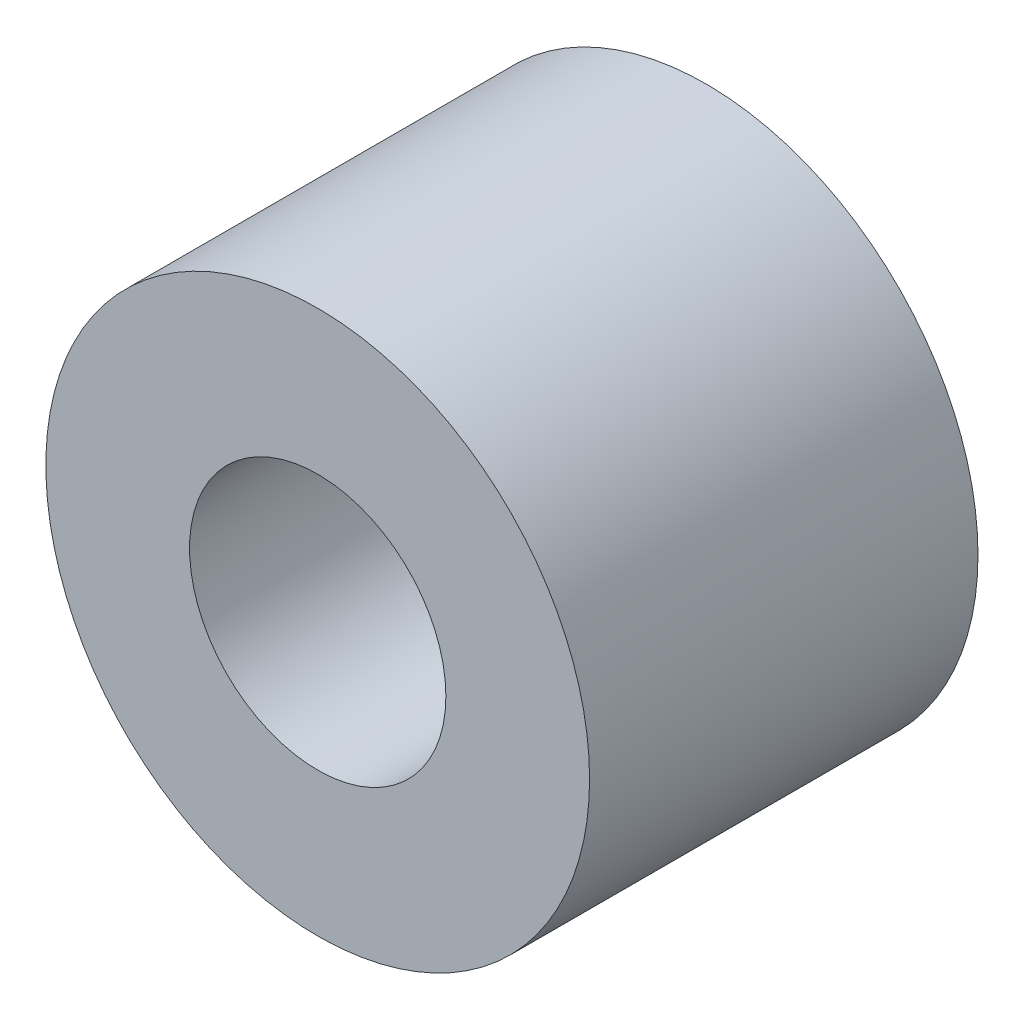
ISO-10303-21;
HEADER;
FILE_DESCRIPTION(('STEP AP214'),'2;1');
FILE_NAME('part.step','',(''),(''),'','','');
FILE_SCHEMA(('AUTOMOTIVE_DESIGN { 1 0 10303 214 1 1 1 1 }'));
ENDSEC;
DATA;
#1=APPLICATION_CONTEXT('core data for automotive mechanical design processes');
#2=APPLICATION_PROTOCOL_DEFINITION('international standard','automotive_design',2000,#1);
#3=PRODUCT_CONTEXT('',#1,'mechanical');
#4=PRODUCT('Part','Part','',(#3));
#5=PRODUCT_RELATED_PRODUCT_CATEGORY('part','',(#4));
#6=PRODUCT_DEFINITION_FORMATION('','',#4);
#7=PRODUCT_DEFINITION_CONTEXT('part definition',#1,'design');
#8=PRODUCT_DEFINITION('design','',#6,#7);
#9=PRODUCT_DEFINITION_SHAPE('','',#8);
#10=(LENGTH_UNIT() NAMED_UNIT(*) SI_UNIT(.MILLI.,.METRE.));
#11=(NAMED_UNIT(*) PLANE_ANGLE_UNIT() SI_UNIT($,.RADIAN.));
#12=(NAMED_UNIT(*) SI_UNIT($,.STERADIAN.) SOLID_ANGLE_UNIT());
#13=UNCERTAINTY_MEASURE_WITH_UNIT(LENGTH_MEASURE(1.E-05),#10,'distance_accuracy_value','');
#14=(GEOMETRIC_REPRESENTATION_CONTEXT(3) GLOBAL_UNCERTAINTY_ASSIGNED_CONTEXT((#13)) GLOBAL_UNIT_ASSIGNED_CONTEXT((#10,
#11,#12)) REPRESENTATION_CONTEXT('',''));
#15=CARTESIAN_POINT('',(0.,0.,0.));
#16=DIRECTION('',(0.,0.,1.));
#17=DIRECTION('',(1.,0.,0.));
#18=AXIS2_PLACEMENT_3D('',#15,#16,#17);
#19=CARTESIAN_POINT('',(0.,0.,5.));
#20=DIRECTION('',(0.,0.,1.));
#21=DIRECTION('',(1.,0.,0.));
#22=AXIS2_PLACEMENT_3D('',#19,#20,#21);
#23=PLANE('',#22);
#24=CARTESIAN_POINT('',(0.,0.,5.));
#25=DIRECTION('',(0.,0.,1.));
#26=DIRECTION('',(1.,0.,0.));
#27=AXIS2_PLACEMENT_3D('',#24,#25,#26);
#28=CIRCLE('',#27,3.5);
#29=CARTESIAN_POINT('',(3.5,0.,5.));
#30=VERTEX_POINT('',#29);
#31=EDGE_CURVE('E10',#30,#30,#28,.T.);
#32=ORIENTED_EDGE('',*,*,#31,.T.);
#33=EDGE_LOOP('',(#32));
#34=FACE_BOUND('',#33,.T.);
#35=CARTESIAN_POINT('',(0.,0.,5.));
#36=DIRECTION('',(0.,0.,1.));
#37=DIRECTION('',(1.,0.,0.));
#38=AXIS2_PLACEMENT_3D('',#35,#36,#37);
#39=CIRCLE('',#38,1.65);
#40=CARTESIAN_POINT('',(1.65,0.,5.));
#41=VERTEX_POINT('',#40);
#42=EDGE_CURVE('E52',#41,#41,#39,.T.);
#43=ORIENTED_EDGE('',*,*,#42,.F.);
#44=EDGE_LOOP('',(#43));
#45=FACE_BOUND('',#44,.T.);
#46=ADVANCED_FACE('F41',(#34,#45),#23,.T.);
#47=CARTESIAN_POINT('',(0.,0.,0.));
#48=DIRECTION('',(0.,0.,1.));
#49=DIRECTION('',(1.,0.,0.));
#50=AXIS2_PLACEMENT_3D('',#47,#48,#49);
#51=PLANE('',#50);
#52=CARTESIAN_POINT('',(0.,0.,0.));
#53=DIRECTION('',(0.,0.,1.));
#54=DIRECTION('',(1.,0.,0.));
#55=AXIS2_PLACEMENT_3D('',#52,#53,#54);
#56=CIRCLE('',#55,3.5);
#57=CARTESIAN_POINT('',(3.5,0.,0.));
#58=VERTEX_POINT('',#57);
#59=EDGE_CURVE('E45',#58,#58,#56,.T.);
#60=ORIENTED_EDGE('',*,*,#59,.F.);
#61=EDGE_LOOP('',(#60));
#62=FACE_BOUND('',#61,.T.);
#63=CARTESIAN_POINT('',(0.,0.,0.));
#64=DIRECTION('',(0.,0.,1.));
#65=DIRECTION('',(1.,0.,0.));
#66=AXIS2_PLACEMENT_3D('',#63,#64,#65);
#67=CIRCLE('',#66,1.65);
#68=CARTESIAN_POINT('',(1.65,0.,0.));
#69=VERTEX_POINT('',#68);
#70=EDGE_CURVE('E54',#69,#69,#67,.T.);
#71=ORIENTED_EDGE('',*,*,#70,.T.);
#72=EDGE_LOOP('',(#71));
#73=FACE_BOUND('',#72,.T.);
#74=ADVANCED_FACE('F64',(#62,#73),#51,.F.);
#75=CARTESIAN_POINT('',(0.,0.,5.));
#76=DIRECTION('',(0.,0.,-1.));
#77=DIRECTION('',(-1.,0.,0.));
#78=AXIS2_PLACEMENT_3D('',#75,#76,#77);
#79=CYLINDRICAL_SURFACE('',#78,3.5);
#80=ORIENTED_EDGE('',*,*,#31,.F.);
#81=EDGE_LOOP('',(#80));
#82=FACE_BOUND('',#81,.T.);
#83=ORIENTED_EDGE('',*,*,#59,.T.);
#84=EDGE_LOOP('',(#83));
#85=FACE_BOUND('',#84,.T.);
#86=ADVANCED_FACE('F43',(#82,#85),#79,.T.);
#87=CARTESIAN_POINT('',(0.,0.,5.));
#88=DIRECTION('',(0.,0.,-1.));
#89=DIRECTION('',(-1.,0.,0.));
#90=AXIS2_PLACEMENT_3D('',#87,#88,#89);
#91=CYLINDRICAL_SURFACE('',#90,1.65);
#92=ORIENTED_EDGE('',*,*,#42,.T.);
#93=EDGE_LOOP('',(#92));
#94=FACE_BOUND('',#93,.T.);
#95=ORIENTED_EDGE('',*,*,#70,.F.);
#96=EDGE_LOOP('',(#95));
#97=FACE_BOUND('',#96,.T.);
#98=ADVANCED_FACE('F60',(#94,#97),#91,.F.);
#99=CLOSED_SHELL('',(#46,#74,#86,#98));
#100=MANIFOLD_SOLID_BREP('B2',#99);
#101=ADVANCED_BREP_SHAPE_REPRESENTATION('',(#18,#100),#14);
#102=SHAPE_DEFINITION_REPRESENTATION(#9,#101);
ENDSEC;
END-ISO-10303-21;
